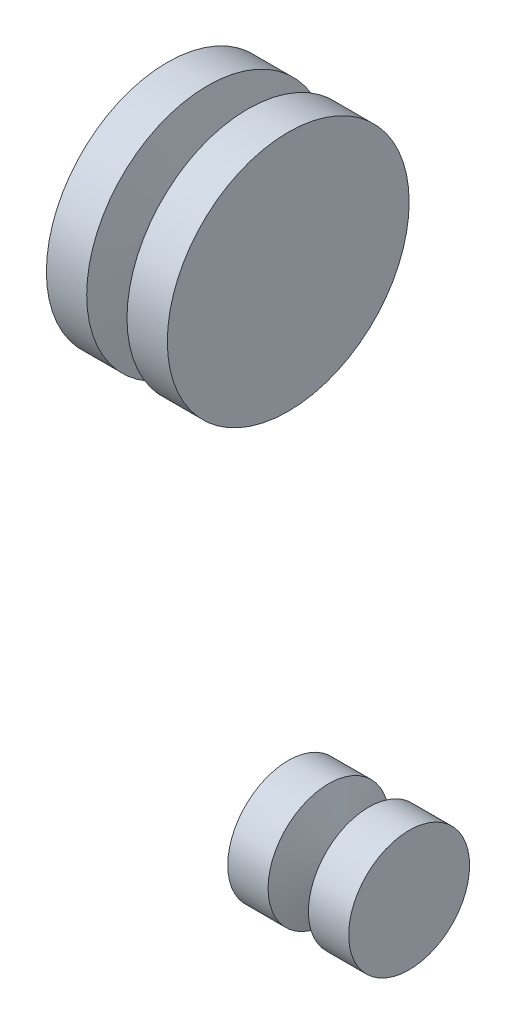
ISO-10303-21;
HEADER;
FILE_DESCRIPTION(('STEP AP214'),'2;1');
FILE_NAME('part.step','',(''),(''),'','','');
FILE_SCHEMA(('AUTOMOTIVE_DESIGN { 1 0 10303 214 1 1 1 1 }'));
ENDSEC;
DATA;
#1=APPLICATION_CONTEXT('core data for automotive mechanical design processes');
#2=APPLICATION_PROTOCOL_DEFINITION('international standard','automotive_design',2000,#1);
#3=PRODUCT_CONTEXT('',#1,'mechanical');
#4=PRODUCT('Part','Part','',(#3));
#5=PRODUCT_RELATED_PRODUCT_CATEGORY('part','',(#4));
#6=PRODUCT_DEFINITION_FORMATION('','',#4);
#7=PRODUCT_DEFINITION_CONTEXT('part definition',#1,'design');
#8=PRODUCT_DEFINITION('design','',#6,#7);
#9=PRODUCT_DEFINITION_SHAPE('','',#8);
#10=(LENGTH_UNIT() NAMED_UNIT(*) SI_UNIT(.MILLI.,.METRE.));
#11=(NAMED_UNIT(*) PLANE_ANGLE_UNIT() SI_UNIT($,.RADIAN.));
#12=(NAMED_UNIT(*) SI_UNIT($,.STERADIAN.) SOLID_ANGLE_UNIT());
#13=UNCERTAINTY_MEASURE_WITH_UNIT(LENGTH_MEASURE(1.E-05),#10,'distance_accuracy_value','');
#14=(GEOMETRIC_REPRESENTATION_CONTEXT(3) GLOBAL_UNCERTAINTY_ASSIGNED_CONTEXT((#13)) GLOBAL_UNIT_ASSIGNED_CONTEXT((#10,
#11,#12)) REPRESENTATION_CONTEXT('',''));
#15=CARTESIAN_POINT('',(0.,0.,0.));
#16=DIRECTION('',(0.,0.,1.));
#17=DIRECTION('',(1.,0.,0.));
#18=AXIS2_PLACEMENT_3D('',#15,#16,#17);
#19=CARTESIAN_POINT('',(5.,100.,20.));
#20=DIRECTION('',(-1.,0.,0.));
#21=DIRECTION('',(0.,0.,1.));
#22=AXIS2_PLACEMENT_3D('',#19,#20,#21);
#23=CYLINDRICAL_SURFACE('',#22,5.);
#24=CARTESIAN_POINT('',(5.,100.,20.));
#25=DIRECTION('',(1.,0.,0.));
#26=DIRECTION('',(0.,0.,-1.));
#27=AXIS2_PLACEMENT_3D('',#24,#25,#26);
#28=CIRCLE('',#27,5.);
#29=CARTESIAN_POINT('',(5.,100.,15.));
#30=VERTEX_POINT('',#29);
#31=EDGE_CURVE('E47',#30,#30,#28,.T.);
#32=ORIENTED_EDGE('',*,*,#31,.F.);
#33=EDGE_LOOP('',(#32));
#34=FACE_BOUND('',#33,.T.);
#35=CARTESIAN_POINT('',(1.66666666666667,100.,20.));
#36=DIRECTION('',(-1.,0.,0.));
#37=DIRECTION('',(0.,0.,1.));
#38=AXIS2_PLACEMENT_3D('',#35,#36,#37);
#39=CIRCLE('',#38,5.00000000000002);
#40=CARTESIAN_POINT('',(1.66666666666667,100.,15.));
#41=VERTEX_POINT('',#40);
#42=EDGE_CURVE('E58',#41,#41,#39,.T.);
#43=ORIENTED_EDGE('',*,*,#42,.F.);
#44=EDGE_LOOP('',(#43));
#45=FACE_BOUND('',#44,.T.);
#46=ADVANCED_FACE('F43',(#34,#45),#23,.T.);
#47=CARTESIAN_POINT('',(5.,100.,20.));
#48=DIRECTION('',(1.,0.,0.));
#49=DIRECTION('',(0.,0.,-1.));
#50=AXIS2_PLACEMENT_3D('',#47,#48,#49);
#51=PLANE('',#50);
#52=ORIENTED_EDGE('',*,*,#31,.T.);
#53=EDGE_LOOP('',(#52));
#54=FACE_BOUND('',#53,.T.);
#55=ADVANCED_FACE('F45',(#54),#51,.T.);
#56=CARTESIAN_POINT('',(-5.,100.,20.));
#57=DIRECTION('',(-1.,0.,0.));
#58=DIRECTION('',(0.,0.,1.));
#59=AXIS2_PLACEMENT_3D('',#56,#57,#58);
#60=CYLINDRICAL_SURFACE('',#59,0.999999999999987);
#61=CARTESIAN_POINT('',(-0.5,100.,20.));
#62=DIRECTION('',(-1.,0.,0.));
#63=DIRECTION('',(0.,0.,1.));
#64=AXIS2_PLACEMENT_3D('',#61,#62,#63);
#65=CIRCLE('',#64,0.999999999999987);
#66=CARTESIAN_POINT('',(-0.5,100.,21.));
#67=VERTEX_POINT('',#66);
#68=EDGE_CURVE('E64',#67,#67,#65,.T.);
#69=ORIENTED_EDGE('',*,*,#68,.F.);
#70=EDGE_LOOP('',(#69));
#71=FACE_BOUND('',#70,.T.);
#72=CARTESIAN_POINT('',(0.5,100.,20.));
#73=DIRECTION('',(-1.,0.,0.));
#74=DIRECTION('',(0.,0.,1.));
#75=AXIS2_PLACEMENT_3D('',#72,#73,#74);
#76=CIRCLE('',#75,0.999999999999987);
#77=CARTESIAN_POINT('',(0.500000000000001,100.,19.));
#78=VERTEX_POINT('',#77);
#79=EDGE_CURVE('E54',#78,#78,#76,.T.);
#80=ORIENTED_EDGE('',*,*,#79,.T.);
#81=EDGE_LOOP('',(#80));
#82=FACE_BOUND('',#81,.T.);
#83=ADVANCED_FACE('F71',(#71,#82),#60,.T.);
#84=CARTESIAN_POINT('',(0.5,100.,20.));
#85=DIRECTION('',(1.,0.,0.));
#86=DIRECTION('',(0.,0.,-1.));
#87=AXIS2_PLACEMENT_3D('',#84,#85,#86);
#88=CONICAL_SURFACE('',#87,0.999999999999987,1.28700221758657);
#89=CARTESIAN_POINT('',(1.66666666666667,100.,15.));
#90=CARTESIAN_POINT('',(1.6545138888889,100.,15.0416666666666));
#91=CARTESIAN_POINT('',(1.64236111111112,100.,15.0833333333333));
#92=CARTESIAN_POINT('',(1.61805555555556,100.,15.1666666666666));
#93=CARTESIAN_POINT('',(1.60590277777778,100.,15.2083333333333));
#94=CARTESIAN_POINT('',(1.58159722222223,100.,15.2916666666666));
#95=CARTESIAN_POINT('',(1.56944444444445,100.,15.3333333333333));
#96=CARTESIAN_POINT('',(1.5451388888889,100.,15.4166666666666));
#97=CARTESIAN_POINT('',(1.53298611111112,100.,15.4583333333333));
#98=CARTESIAN_POINT('',(1.50868055555556,100.,15.5416666666667));
#99=CARTESIAN_POINT('',(1.49652777777778,100.,15.5833333333333));
#100=CARTESIAN_POINT('',(1.47222222222223,100.,15.6666666666666));
#101=CARTESIAN_POINT('',(1.46006944444445,100.,15.7083333333333));
#102=CARTESIAN_POINT('',(1.43576388888889,100.,15.7916666666667));
#103=CARTESIAN_POINT('',(1.42361111111112,100.,15.8333333333333));
#104=CARTESIAN_POINT('',(1.39930555555556,100.,15.9166666666667));
#105=CARTESIAN_POINT('',(1.38715277777778,100.,15.9583333333333));
#106=CARTESIAN_POINT('',(1.36284722222223,100.,16.0416666666667));
#107=CARTESIAN_POINT('',(1.35069444444445,100.,16.0833333333333));
#108=CARTESIAN_POINT('',(1.32638888888889,100.,16.1666666666667));
#109=CARTESIAN_POINT('',(1.31423611111112,100.,16.2083333333333));
#110=CARTESIAN_POINT('',(1.28993055555556,100.,16.2916666666667));
#111=CARTESIAN_POINT('',(1.27777777777778,100.,16.3333333333333));
#112=CARTESIAN_POINT('',(1.25347222222223,100.,16.4166666666667));
#113=CARTESIAN_POINT('',(1.24131944444445,100.,16.4583333333333));
#114=CARTESIAN_POINT('',(1.21701388888889,100.,16.5416666666667));
#115=CARTESIAN_POINT('',(1.20486111111112,100.,16.5833333333333));
#116=CARTESIAN_POINT('',(1.18055555555556,100.,16.6666666666667));
#117=CARTESIAN_POINT('',(1.16840277777778,100.,16.7083333333333));
#118=CARTESIAN_POINT('',(1.14409722222223,100.,16.7916666666667));
#119=CARTESIAN_POINT('',(1.13194444444445,100.,16.8333333333333));
#120=CARTESIAN_POINT('',(1.10763888888889,100.,16.9166666666667));
#121=CARTESIAN_POINT('',(1.09548611111112,100.,16.9583333333333));
#122=CARTESIAN_POINT('',(1.07118055555556,100.,17.0416666666667));
#123=CARTESIAN_POINT('',(1.05902777777778,100.,17.0833333333333));
#124=CARTESIAN_POINT('',(1.03472222222223,100.,17.1666666666667));
#125=CARTESIAN_POINT('',(1.02256944444445,100.,17.2083333333333));
#126=CARTESIAN_POINT('',(0.998263888888892,100.,17.2916666666667));
#127=CARTESIAN_POINT('',(0.986111111111114,100.,17.3333333333333));
#128=CARTESIAN_POINT('',(0.961805555555559,100.,17.4166666666667));
#129=CARTESIAN_POINT('',(0.949652777777781,100.,17.4583333333333));
#130=CARTESIAN_POINT('',(0.925347222222225,100.,17.5416666666667));
#131=CARTESIAN_POINT('',(0.913194444444447,100.,17.5833333333333));
#132=CARTESIAN_POINT('',(0.888888888888892,100.,17.6666666666667));
#133=CARTESIAN_POINT('',(0.876736111111114,100.,17.7083333333333));
#134=CARTESIAN_POINT('',(0.852430555555558,100.,17.7916666666667));
#135=CARTESIAN_POINT('',(0.84027777777778,100.,17.8333333333333));
#136=CARTESIAN_POINT('',(0.815972222222225,100.,17.9166666666667));
#137=CARTESIAN_POINT('',(0.803819444444447,100.,17.9583333333333));
#138=CARTESIAN_POINT('',(0.779513888888891,100.,18.0416666666667));
#139=CARTESIAN_POINT('',(0.767361111111113,100.,18.0833333333333));
#140=CARTESIAN_POINT('',(0.743055555555557,100.,18.1666666666667));
#141=CARTESIAN_POINT('',(0.730902777777779,100.,18.2083333333333));
#142=CARTESIAN_POINT('',(0.706597222222224,100.,18.2916666666667));
#143=CARTESIAN_POINT('',(0.694444444444446,100.,18.3333333333333));
#144=CARTESIAN_POINT('',(0.670138888888891,100.,18.4166666666667));
#145=CARTESIAN_POINT('',(0.657986111111113,100.,18.4583333333333));
#146=CARTESIAN_POINT('',(0.633680555555557,100.,18.5416666666667));
#147=CARTESIAN_POINT('',(0.621527777777779,100.,18.5833333333333));
#148=CARTESIAN_POINT('',(0.597222222222223,100.,18.6666666666667));
#149=CARTESIAN_POINT('',(0.585069444444445,100.,18.7083333333333));
#150=CARTESIAN_POINT('',(0.56076388888889,100.,18.7916666666667));
#151=CARTESIAN_POINT('',(0.548611111111112,100.,18.8333333333333));
#152=CARTESIAN_POINT('',(0.524305555555556,100.,18.9166666666667));
#153=CARTESIAN_POINT('',(0.512152777777778,100.,18.9583333333333));
#154=CARTESIAN_POINT('',(0.5,100.,19.));
#155=B_SPLINE_CURVE_WITH_KNOTS('',3,(#89,#90,#91,#92,#93,#94,#95,#96,#97,#98,#99,#100,#101,#102,
#103,#104,#105,#106,#107,#108,#109,#110,#111,#112,#113,#114,#115,#116,#117,#118,#119,#120,#121,
#122,#123,#124,#125,#126,#127,#128,#129,#130,#131,#132,#133,#134,#135,#136,#137,#138,#139,#140,
#141,#142,#143,#144,#145,#146,#147,#148,#149,#150,#151,#152,#153,#154),.UNSPECIFIED.,.F.,.F.,(4,
2,2,2,2,2,2,2,2,2,2,2,2,2,2,2,2,2,2,2,2,2,2,2,2,2,2,2,2,2,2,2,4),(0.,0.130208333333334,
0.260416666666667,0.390625000000002,0.520833333333337,0.651041666666671,0.781250000000004,
0.911458333333341,1.04166666666667,1.17187500000001,1.30208333333334,1.43229166666668,
1.56250000000001,1.69270833333335,1.82291666666668,1.95312500000002,2.08333333333335,
2.21354166666668,2.34375000000002,2.47395833333335,2.60416666666669,2.73437500000002,
2.86458333333335,2.99479166666669,3.12500000000002,3.25520833333336,3.38541666666669,
3.51562500000003,3.64583333333336,3.77604166666669,3.90625000000003,4.03645833333337,
4.1666666666667),.UNSPECIFIED.);
#156=EDGE_CURVE('BSEAM74',#41,#78,#155,.T.);
#157=ORIENTED_EDGE('',*,*,#42,.T.);
#158=ORIENTED_EDGE('',*,*,#79,.F.);
#159=ORIENTED_EDGE('',*,*,#156,.T.);
#160=ORIENTED_EDGE('',*,*,#156,.F.);
#161=EDGE_LOOP('',(#157,#159,#158,#160));
#162=FACE_BOUND('',#161,.T.);
#163=ADVANCED_FACE('F74',(#162),#88,.T.);
#164=CARTESIAN_POINT('',(-1.66666666666667,100.,20.));
#165=DIRECTION('',(-1.,0.,0.));
#166=DIRECTION('',(0.,0.,1.));
#167=AXIS2_PLACEMENT_3D('',#164,#165,#166);
#168=CONICAL_SURFACE('',#167,5.,1.28700221758657);
#169=CARTESIAN_POINT('',(-1.66666666666667,100.,20.));
#170=DIRECTION('',(-1.,0.,0.));
#171=DIRECTION('',(0.,0.,1.));
#172=AXIS2_PLACEMENT_3D('',#169,#170,#171);
#173=CIRCLE('',#172,5.);
#174=CARTESIAN_POINT('',(-1.66666666666667,100.,25.));
#175=VERTEX_POINT('',#174);
#176=EDGE_CURVE('E61',#175,#175,#173,.T.);
#177=CARTESIAN_POINT('',(-0.5,100.,21.));
#178=CARTESIAN_POINT('',(-0.512152777777778,100.,21.0416666666667));
#179=CARTESIAN_POINT('',(-0.524305555555556,100.,21.0833333333333));
#180=CARTESIAN_POINT('',(-0.548611111111111,100.,21.1666666666667));
#181=CARTESIAN_POINT('',(-0.560763888888889,100.,21.2083333333333));
#182=CARTESIAN_POINT('',(-0.585069444444445,100.,21.2916666666667));
#183=CARTESIAN_POINT('',(-0.597222222222223,100.,21.3333333333333));
#184=CARTESIAN_POINT('',(-0.621527777777778,100.,21.4166666666667));
#185=CARTESIAN_POINT('',(-0.633680555555556,100.,21.4583333333333));
#186=CARTESIAN_POINT('',(-0.657986111111112,100.,21.5416666666667));
#187=CARTESIAN_POINT('',(-0.670138888888889,100.,21.5833333333333));
#188=CARTESIAN_POINT('',(-0.694444444444445,100.,21.6666666666667));
#189=CARTESIAN_POINT('',(-0.706597222222222,100.,21.7083333333333));
#190=CARTESIAN_POINT('',(-0.730902777777778,100.,21.7916666666667));
#191=CARTESIAN_POINT('',(-0.743055555555556,100.,21.8333333333333));
#192=CARTESIAN_POINT('',(-0.767361111111111,100.,21.9166666666667));
#193=CARTESIAN_POINT('',(-0.779513888888889,100.,21.9583333333333));
#194=CARTESIAN_POINT('',(-0.803819444444445,100.,22.0416666666667));
#195=CARTESIAN_POINT('',(-0.815972222222223,100.,22.0833333333333));
#196=CARTESIAN_POINT('',(-0.840277777777778,100.,22.1666666666667));
#197=CARTESIAN_POINT('',(-0.852430555555556,100.,22.2083333333333));
#198=CARTESIAN_POINT('',(-0.876736111111111,100.,22.2916666666667));
#199=CARTESIAN_POINT('',(-0.888888888888889,100.,22.3333333333333));
#200=CARTESIAN_POINT('',(-0.913194444444445,100.,22.4166666666667));
#201=CARTESIAN_POINT('',(-0.925347222222223,100.,22.4583333333333));
#202=CARTESIAN_POINT('',(-0.949652777777778,100.,22.5416666666667));
#203=CARTESIAN_POINT('',(-0.961805555555555,100.,22.5833333333333));
#204=CARTESIAN_POINT('',(-0.986111111111111,100.,22.6666666666667));
#205=CARTESIAN_POINT('',(-0.998263888888889,100.,22.7083333333333));
#206=CARTESIAN_POINT('',(-1.02256944444444,100.,22.7916666666667));
#207=CARTESIAN_POINT('',(-1.03472222222222,100.,22.8333333333333));
#208=CARTESIAN_POINT('',(-1.05902777777778,100.,22.9166666666667));
#209=CARTESIAN_POINT('',(-1.07118055555556,100.,22.9583333333333));
#210=CARTESIAN_POINT('',(-1.09548611111111,100.,23.0416666666667));
#211=CARTESIAN_POINT('',(-1.10763888888889,100.,23.0833333333333));
#212=CARTESIAN_POINT('',(-1.13194444444444,100.,23.1666666666667));
#213=CARTESIAN_POINT('',(-1.14409722222222,100.,23.2083333333333));
#214=CARTESIAN_POINT('',(-1.16840277777778,100.,23.2916666666667));
#215=CARTESIAN_POINT('',(-1.18055555555556,100.,23.3333333333333));
#216=CARTESIAN_POINT('',(-1.20486111111111,100.,23.4166666666667));
#217=CARTESIAN_POINT('',(-1.21701388888889,100.,23.4583333333333));
#218=CARTESIAN_POINT('',(-1.24131944444444,100.,23.5416666666667));
#219=CARTESIAN_POINT('',(-1.25347222222222,100.,23.5833333333333));
#220=CARTESIAN_POINT('',(-1.27777777777778,100.,23.6666666666667));
#221=CARTESIAN_POINT('',(-1.28993055555556,100.,23.7083333333333));
#222=CARTESIAN_POINT('',(-1.31423611111111,100.,23.7916666666667));
#223=CARTESIAN_POINT('',(-1.32638888888889,100.,23.8333333333333));
#224=CARTESIAN_POINT('',(-1.35069444444444,100.,23.9166666666667));
#225=CARTESIAN_POINT('',(-1.36284722222222,100.,23.9583333333333));
#226=CARTESIAN_POINT('',(-1.38715277777778,100.,24.0416666666667));
#227=CARTESIAN_POINT('',(-1.39930555555556,100.,24.0833333333333));
#228=CARTESIAN_POINT('',(-1.42361111111111,100.,24.1666666666667));
#229=CARTESIAN_POINT('',(-1.43576388888889,100.,24.2083333333333));
#230=CARTESIAN_POINT('',(-1.46006944444444,100.,24.2916666666667));
#231=CARTESIAN_POINT('',(-1.47222222222222,100.,24.3333333333333));
#232=CARTESIAN_POINT('',(-1.49652777777778,100.,24.4166666666667));
#233=CARTESIAN_POINT('',(-1.50868055555556,100.,24.4583333333333));
#234=CARTESIAN_POINT('',(-1.53298611111111,100.,24.5416666666667));
#235=CARTESIAN_POINT('',(-1.54513888888889,100.,24.5833333333333));
#236=CARTESIAN_POINT('',(-1.56944444444444,100.,24.6666666666667));
#237=CARTESIAN_POINT('',(-1.58159722222222,100.,24.7083333333333));
#238=CARTESIAN_POINT('',(-1.60590277777778,100.,24.7916666666667));
#239=CARTESIAN_POINT('',(-1.61805555555556,100.,24.8333333333333));
#240=CARTESIAN_POINT('',(-1.64236111111111,100.,24.9166666666667));
#241=CARTESIAN_POINT('',(-1.65451388888889,100.,24.9583333333333));
#242=CARTESIAN_POINT('',(-1.66666666666667,100.,25.));
#243=B_SPLINE_CURVE_WITH_KNOTS('',3,(#177,#178,#179,#180,#181,#182,#183,#184,#185,#186,#187,
#188,#189,#190,#191,#192,#193,#194,#195,#196,#197,#198,#199,#200,#201,#202,#203,#204,#205,#206,
#207,#208,#209,#210,#211,#212,#213,#214,#215,#216,#217,#218,#219,#220,#221,#222,#223,#224,#225,
#226,#227,#228,#229,#230,#231,#232,#233,#234,#235,#236,#237,#238,#239,#240,#241,#242),
.UNSPECIFIED.,.F.,.F.,(4,2,2,2,2,2,2,2,2,2,2,2,2,2,2,2,2,2,2,2,2,2,2,2,2,2,2,2,2,2,2,2,4),(0.,
0.130208333333333,0.260416666666667,0.390625,0.520833333333334,0.651041666666667,
0.781250000000004,0.911458333333337,1.04166666666667,1.171875,1.30208333333334,1.43229166666667,
1.5625,1.69270833333334,1.82291666666668,1.95312500000001,2.08333333333334,2.21354166666668,
2.34375000000001,2.47395833333334,2.60416666666668,2.73437500000001,2.86458333333335,
2.99479166666668,3.12500000000001,3.25520833333335,3.38541666666668,3.51562500000001,
3.64583333333335,3.77604166666668,3.90625000000002,4.03645833333335,4.16666666666668),.UNSPECIFIED.);
#244=EDGE_CURVE('BSEAM68',#67,#175,#243,.T.);
#245=ORIENTED_EDGE('',*,*,#68,.T.);
#246=ORIENTED_EDGE('',*,*,#176,.F.);
#247=ORIENTED_EDGE('',*,*,#244,.T.);
#248=ORIENTED_EDGE('',*,*,#244,.F.);
#249=EDGE_LOOP('',(#245,#247,#246,#248));
#250=FACE_BOUND('',#249,.T.);
#251=ADVANCED_FACE('F68',(#250),#168,.T.);
#252=CARTESIAN_POINT('',(-5.,100.,20.));
#253=DIRECTION('',(1.,0.,0.));
#254=DIRECTION('',(0.,0.,-1.));
#255=AXIS2_PLACEMENT_3D('',#252,#253,#254);
#256=PLANE('',#255);
#257=CARTESIAN_POINT('',(-5.,100.,20.));
#258=DIRECTION('',(1.,0.,0.));
#259=DIRECTION('',(0.,0.,-1.));
#260=AXIS2_PLACEMENT_3D('',#257,#258,#259);
#261=CIRCLE('',#260,5.);
#262=CARTESIAN_POINT('',(-5.,100.,15.));
#263=VERTEX_POINT('',#262);
#264=EDGE_CURVE('E11',#263,#263,#261,.T.);
#265=ORIENTED_EDGE('',*,*,#264,.F.);
#266=EDGE_LOOP('',(#265));
#267=FACE_BOUND('',#266,.T.);
#268=ADVANCED_FACE('F84',(#267),#256,.F.);
#269=ORIENTED_EDGE('',*,*,#264,.T.);
#270=EDGE_LOOP('',(#269));
#271=FACE_BOUND('',#270,.T.);
#272=ORIENTED_EDGE('',*,*,#176,.T.);
#273=EDGE_LOOP('',(#272));
#274=FACE_BOUND('',#273,.T.);
#275=ADVANCED_FACE('F89',(#271,#274),#23,.T.);
#276=CLOSED_SHELL('',(#46,#55,#83,#163,#251,#268,#275));
#277=MANIFOLD_SOLID_BREP('B2',#276);
#278=CARTESIAN_POINT('',(5.,150.,30.));
#279=DIRECTION('',(-1.,0.,0.));
#280=DIRECTION('',(0.,0.,1.));
#281=AXIS2_PLACEMENT_3D('',#278,#279,#280);
#282=CYLINDRICAL_SURFACE('',#281,10.);
#283=CARTESIAN_POINT('',(5.,150.,30.));
#284=DIRECTION('',(1.,0.,0.));
#285=DIRECTION('',(0.,0.,-1.));
#286=AXIS2_PLACEMENT_3D('',#283,#284,#285);
#287=CIRCLE('',#286,10.);
#288=CARTESIAN_POINT('',(5.,150.,20.));
#289=VERTEX_POINT('',#288);
#290=EDGE_CURVE('E42',#289,#289,#287,.T.);
#291=ORIENTED_EDGE('',*,*,#290,.F.);
#292=EDGE_LOOP('',(#291));
#293=FACE_BOUND('',#292,.T.);
#294=CARTESIAN_POINT('',(1.66666666666667,150.,30.));
#295=DIRECTION('',(-1.,0.,0.));
#296=DIRECTION('',(0.,0.,1.));
#297=AXIS2_PLACEMENT_3D('',#294,#295,#296);
#298=CIRCLE('',#297,10.);
#299=CARTESIAN_POINT('',(1.66666666666667,150.,20.));
#300=VERTEX_POINT('',#299);
#301=EDGE_CURVE('E167',#300,#300,#298,.T.);
#302=ORIENTED_EDGE('',*,*,#301,.F.);
#303=EDGE_LOOP('',(#302));
#304=FACE_BOUND('',#303,.T.);
#305=ADVANCED_FACE('F157',(#293,#304),#282,.T.);
#306=CARTESIAN_POINT('',(5.,150.,30.));
#307=DIRECTION('',(1.,0.,0.));
#308=DIRECTION('',(0.,0.,-1.));
#309=AXIS2_PLACEMENT_3D('',#306,#307,#308);
#310=PLANE('',#309);
#311=ORIENTED_EDGE('',*,*,#290,.T.);
#312=EDGE_LOOP('',(#311));
#313=FACE_BOUND('',#312,.T.);
#314=ADVANCED_FACE('F187',(#313),#310,.T.);
#315=CARTESIAN_POINT('',(0.500000000000001,150.,30.));
#316=DIRECTION('',(1.,0.,0.));
#317=DIRECTION('',(0.,0.,-1.));
#318=AXIS2_PLACEMENT_3D('',#315,#316,#317);
#319=CONICAL_SURFACE('',#318,1.,1.44188555511091);
#320=CARTESIAN_POINT('',(0.500000000000001,150.,30.));
#321=DIRECTION('',(-1.,0.,0.));
#322=DIRECTION('',(0.,0.,1.));
#323=AXIS2_PLACEMENT_3D('',#320,#321,#322);
#324=CIRCLE('',#323,1.);
#325=CARTESIAN_POINT('',(0.500000000000001,150.,29.));
#326=VERTEX_POINT('',#325);
#327=EDGE_CURVE('E177',#326,#326,#324,.T.);
#328=CARTESIAN_POINT('',(1.66666666666667,150.,20.));
#329=CARTESIAN_POINT('',(1.65451388888889,150.,20.09375));
#330=CARTESIAN_POINT('',(1.64236111111111,150.,20.1875));
#331=CARTESIAN_POINT('',(1.61805555555556,150.,20.375));
#332=CARTESIAN_POINT('',(1.60590277777778,150.,20.46875));
#333=CARTESIAN_POINT('',(1.58159722222222,150.,20.65625));
#334=CARTESIAN_POINT('',(1.56944444444444,150.,20.75));
#335=CARTESIAN_POINT('',(1.54513888888889,150.,20.9375));
#336=CARTESIAN_POINT('',(1.53298611111111,150.,21.03125));
#337=CARTESIAN_POINT('',(1.50868055555556,150.,21.21875));
#338=CARTESIAN_POINT('',(1.49652777777778,150.,21.3125));
#339=CARTESIAN_POINT('',(1.47222222222222,150.,21.5));
#340=CARTESIAN_POINT('',(1.46006944444444,150.,21.59375));
#341=CARTESIAN_POINT('',(1.43576388888889,150.,21.78125));
#342=CARTESIAN_POINT('',(1.42361111111111,150.,21.875));
#343=CARTESIAN_POINT('',(1.39930555555556,150.,22.0625));
#344=CARTESIAN_POINT('',(1.38715277777778,150.,22.15625));
#345=CARTESIAN_POINT('',(1.36284722222222,150.,22.34375));
#346=CARTESIAN_POINT('',(1.35069444444444,150.,22.4375));
#347=CARTESIAN_POINT('',(1.32638888888889,150.,22.625));
#348=CARTESIAN_POINT('',(1.31423611111111,150.,22.71875));
#349=CARTESIAN_POINT('',(1.28993055555556,150.,22.90625));
#350=CARTESIAN_POINT('',(1.27777777777778,150.,23.));
#351=CARTESIAN_POINT('',(1.25347222222222,150.,23.1875));
#352=CARTESIAN_POINT('',(1.24131944444444,150.,23.28125));
#353=CARTESIAN_POINT('',(1.21701388888889,150.,23.46875));
#354=CARTESIAN_POINT('',(1.20486111111111,150.,23.5625));
#355=CARTESIAN_POINT('',(1.18055555555556,150.,23.75));
#356=CARTESIAN_POINT('',(1.16840277777778,150.,23.84375));
#357=CARTESIAN_POINT('',(1.14409722222222,150.,24.03125));
#358=CARTESIAN_POINT('',(1.13194444444444,150.,24.125));
#359=CARTESIAN_POINT('',(1.10763888888889,150.,24.3125));
#360=CARTESIAN_POINT('',(1.09548611111111,150.,24.40625));
#361=CARTESIAN_POINT('',(1.07118055555556,150.,24.59375));
#362=CARTESIAN_POINT('',(1.05902777777778,150.,24.6875));
#363=CARTESIAN_POINT('',(1.03472222222222,150.,24.875));
#364=CARTESIAN_POINT('',(1.02256944444445,150.,24.96875));
#365=CARTESIAN_POINT('',(0.99826388888889,150.,25.15625));
#366=CARTESIAN_POINT('',(0.986111111111111,150.,25.25));
#367=CARTESIAN_POINT('',(0.961805555555556,150.,25.4375));
#368=CARTESIAN_POINT('',(0.949652777777778,150.,25.53125));
#369=CARTESIAN_POINT('',(0.925347222222223,150.,25.71875));
#370=CARTESIAN_POINT('',(0.913194444444445,150.,25.8125));
#371=CARTESIAN_POINT('',(0.88888888888889,150.,26.));
#372=CARTESIAN_POINT('',(0.876736111111112,150.,26.09375));
#373=CARTESIAN_POINT('',(0.852430555555556,150.,26.28125));
#374=CARTESIAN_POINT('',(0.840277777777779,150.,26.375));
#375=CARTESIAN_POINT('',(0.815972222222223,150.,26.5625));
#376=CARTESIAN_POINT('',(0.803819444444445,150.,26.65625));
#377=CARTESIAN_POINT('',(0.77951388888889,150.,26.84375));
#378=CARTESIAN_POINT('',(0.767361111111112,150.,26.9375));
#379=CARTESIAN_POINT('',(0.743055555555556,150.,27.125));
#380=CARTESIAN_POINT('',(0.730902777777779,150.,27.21875));
#381=CARTESIAN_POINT('',(0.706597222222223,150.,27.40625));
#382=CARTESIAN_POINT('',(0.694444444444445,150.,27.5));
#383=CARTESIAN_POINT('',(0.67013888888889,150.,27.6875));
#384=CARTESIAN_POINT('',(0.657986111111112,150.,27.78125));
#385=CARTESIAN_POINT('',(0.633680555555557,150.,27.96875));
#386=CARTESIAN_POINT('',(0.621527777777779,150.,28.0625));
#387=CARTESIAN_POINT('',(0.597222222222223,150.,28.25));
#388=CARTESIAN_POINT('',(0.585069444444446,150.,28.34375));
#389=CARTESIAN_POINT('',(0.56076388888889,150.,28.53125));
#390=CARTESIAN_POINT('',(0.548611111111112,150.,28.625));
#391=CARTESIAN_POINT('',(0.524305555555557,150.,28.8125));
#392=CARTESIAN_POINT('',(0.512152777777779,150.,28.90625));
#393=CARTESIAN_POINT('',(0.500000000000001,150.,29.));
#394=B_SPLINE_CURVE_WITH_KNOTS('',3,(#328,#329,#330,#331,#332,#333,#334,#335,#336,#337,#338,
#339,#340,#341,#342,#343,#344,#345,#346,#347,#348,#349,#350,#351,#352,#353,#354,#355,#356,#357,
#358,#359,#360,#361,#362,#363,#364,#365,#366,#367,#368,#369,#370,#371,#372,#373,#374,#375,#376,
#377,#378,#379,#380,#381,#382,#383,#384,#385,#386,#387,#388,#389,#390,#391,#392,#393),
.UNSPECIFIED.,.F.,.F.,(4,2,2,2,2,2,2,2,2,2,2,2,2,2,2,2,2,2,2,2,2,2,2,2,2,2,2,2,2,2,2,2,4),(0.,
0.283603195626295,0.567206391252583,0.850809586878878,1.13441278250517,1.41801597813146,
1.70161917375775,1.98522236938404,2.26882556501034,2.55242876063663,2.83603195626292,
3.11963515188921,3.4032383475155,3.68684154314179,3.97044473876809,4.25404793439438,
4.53765113002067,4.82125432564696,5.10485752127325,5.38846071689954,5.67206391252584,
5.95566710815213,6.23927030377842,6.52287349940471,6.806476695031,7.0900798906573,
7.37368308628359,7.65728628190988,7.94088947753617,8.22449267316246,8.50809586878875,
8.79169906441505,9.07530226004134),.UNSPECIFIED.);
#395=EDGE_CURVE('BSEAM184',#300,#326,#394,.T.);
#396=ORIENTED_EDGE('',*,*,#301,.T.);
#397=ORIENTED_EDGE('',*,*,#327,.F.);
#398=ORIENTED_EDGE('',*,*,#395,.T.);
#399=ORIENTED_EDGE('',*,*,#395,.F.);
#400=EDGE_LOOP('',(#396,#398,#397,#399));
#401=FACE_BOUND('',#400,.T.);
#402=ADVANCED_FACE('F184',(#401),#319,.T.);
#403=CARTESIAN_POINT('',(-1.66666666666667,150.,30.));
#404=DIRECTION('',(-1.,0.,0.));
#405=DIRECTION('',(0.,0.,1.));
#406=AXIS2_PLACEMENT_3D('',#403,#404,#405);
#407=CONICAL_SURFACE('',#406,10.,1.44188555511091);
#408=CARTESIAN_POINT('',(-0.499999999999999,150.,30.));
#409=DIRECTION('',(-1.,0.,0.));
#410=DIRECTION('',(0.,0.,1.));
#411=AXIS2_PLACEMENT_3D('',#408,#409,#410);
#412=CIRCLE('',#411,1.);
#413=CARTESIAN_POINT('',(-0.499999999999999,150.,31.));
#414=VERTEX_POINT('',#413);
#415=EDGE_CURVE('E174',#414,#414,#412,.T.);
#416=CARTESIAN_POINT('',(-1.66666666666667,150.,30.));
#417=DIRECTION('',(-1.,0.,0.));
#418=DIRECTION('',(0.,0.,1.));
#419=AXIS2_PLACEMENT_3D('',#416,#417,#418);
#420=CIRCLE('',#419,10.);
#421=CARTESIAN_POINT('',(-1.66666666666667,150.,40.));
#422=VERTEX_POINT('',#421);
#423=EDGE_CURVE('E171',#422,#422,#420,.T.);
#424=CARTESIAN_POINT('',(-0.499999999999999,150.,31.));
#425=CARTESIAN_POINT('',(-0.512152777777777,150.,31.09375));
#426=CARTESIAN_POINT('',(-0.524305555555555,150.,31.1875));
#427=CARTESIAN_POINT('',(-0.54861111111111,150.,31.375));
#428=CARTESIAN_POINT('',(-0.560763888888887,150.,31.46875));
#429=CARTESIAN_POINT('',(-0.585069444444443,150.,31.65625));
#430=CARTESIAN_POINT('',(-0.597222222222221,150.,31.75));
#431=CARTESIAN_POINT('',(-0.621527777777777,150.,31.9375));
#432=CARTESIAN_POINT('',(-0.633680555555555,150.,32.03125));
#433=CARTESIAN_POINT('',(-0.65798611111111,150.,32.21875));
#434=CARTESIAN_POINT('',(-0.670138888888888,150.,32.3125));
#435=CARTESIAN_POINT('',(-0.694444444444443,150.,32.5));
#436=CARTESIAN_POINT('',(-0.706597222222221,150.,32.59375));
#437=CARTESIAN_POINT('',(-0.730902777777777,150.,32.78125));
#438=CARTESIAN_POINT('',(-0.743055555555554,150.,32.875));
#439=CARTESIAN_POINT('',(-0.76736111111111,150.,33.0625));
#440=CARTESIAN_POINT('',(-0.779513888888888,150.,33.15625));
#441=CARTESIAN_POINT('',(-0.803819444444444,150.,33.34375));
#442=CARTESIAN_POINT('',(-0.815972222222221,150.,33.4375));
#443=CARTESIAN_POINT('',(-0.840277777777777,150.,33.625));
#444=CARTESIAN_POINT('',(-0.852430555555555,150.,33.71875));
#445=CARTESIAN_POINT('',(-0.87673611111111,150.,33.90625));
#446=CARTESIAN_POINT('',(-0.888888888888888,150.,34.));
#447=CARTESIAN_POINT('',(-0.913194444444443,150.,34.1875));
#448=CARTESIAN_POINT('',(-0.925347222222222,150.,34.28125));
#449=CARTESIAN_POINT('',(-0.949652777777777,150.,34.46875));
#450=CARTESIAN_POINT('',(-0.961805555555554,150.,34.5625));
#451=CARTESIAN_POINT('',(-0.98611111111111,150.,34.75));
#452=CARTESIAN_POINT('',(-0.998263888888888,150.,34.84375));
#453=CARTESIAN_POINT('',(-1.02256944444444,150.,35.03125));
#454=CARTESIAN_POINT('',(-1.03472222222222,150.,35.125));
#455=CARTESIAN_POINT('',(-1.05902777777778,150.,35.3125));
#456=CARTESIAN_POINT('',(-1.07118055555556,150.,35.40625));
#457=CARTESIAN_POINT('',(-1.09548611111111,150.,35.59375));
#458=CARTESIAN_POINT('',(-1.10763888888889,150.,35.6875));
#459=CARTESIAN_POINT('',(-1.13194444444444,150.,35.875));
#460=CARTESIAN_POINT('',(-1.14409722222222,150.,35.96875));
#461=CARTESIAN_POINT('',(-1.16840277777778,150.,36.15625));
#462=CARTESIAN_POINT('',(-1.18055555555555,150.,36.25));
#463=CARTESIAN_POINT('',(-1.20486111111111,150.,36.4375));
#464=CARTESIAN_POINT('',(-1.21701388888889,150.,36.53125));
#465=CARTESIAN_POINT('',(-1.24131944444444,150.,36.71875));
#466=CARTESIAN_POINT('',(-1.25347222222222,150.,36.8125));
#467=CARTESIAN_POINT('',(-1.27777777777778,150.,37.));
#468=CARTESIAN_POINT('',(-1.28993055555555,150.,37.09375));
#469=CARTESIAN_POINT('',(-1.31423611111111,150.,37.28125));
#470=CARTESIAN_POINT('',(-1.32638888888889,150.,37.375));
#471=CARTESIAN_POINT('',(-1.35069444444444,150.,37.5625));
#472=CARTESIAN_POINT('',(-1.36284722222222,150.,37.65625));
#473=CARTESIAN_POINT('',(-1.38715277777778,150.,37.84375));
#474=CARTESIAN_POINT('',(-1.39930555555556,150.,37.9375));
#475=CARTESIAN_POINT('',(-1.42361111111111,150.,38.125));
#476=CARTESIAN_POINT('',(-1.43576388888889,150.,38.21875));
#477=CARTESIAN_POINT('',(-1.46006944444444,150.,38.40625));
#478=CARTESIAN_POINT('',(-1.47222222222222,150.,38.5));
#479=CARTESIAN_POINT('',(-1.49652777777778,150.,38.6875));
#480=CARTESIAN_POINT('',(-1.50868055555556,150.,38.78125));
#481=CARTESIAN_POINT('',(-1.53298611111111,150.,38.96875));
#482=CARTESIAN_POINT('',(-1.54513888888889,150.,39.0625));
#483=CARTESIAN_POINT('',(-1.56944444444444,150.,39.25));
#484=CARTESIAN_POINT('',(-1.58159722222222,150.,39.34375));
#485=CARTESIAN_POINT('',(-1.60590277777778,150.,39.53125));
#486=CARTESIAN_POINT('',(-1.61805555555556,150.,39.625));
#487=CARTESIAN_POINT('',(-1.64236111111111,150.,39.8125));
#488=CARTESIAN_POINT('',(-1.65451388888889,150.,39.90625));
#489=CARTESIAN_POINT('',(-1.66666666666667,150.,40.));
#490=B_SPLINE_CURVE_WITH_KNOTS('',3,(#424,#425,#426,#427,#428,#429,#430,#431,#432,#433,#434,
#435,#436,#437,#438,#439,#440,#441,#442,#443,#444,#445,#446,#447,#448,#449,#450,#451,#452,#453,
#454,#455,#456,#457,#458,#459,#460,#461,#462,#463,#464,#465,#466,#467,#468,#469,#470,#471,#472,
#473,#474,#475,#476,#477,#478,#479,#480,#481,#482,#483,#484,#485,#486,#487,#488,#489),
.UNSPECIFIED.,.F.,.F.,(4,2,2,2,2,2,2,2,2,2,2,2,2,2,2,2,2,2,2,2,2,2,2,2,2,2,2,2,2,2,2,2,4),(0.,
0.283603195626292,0.567206391252587,0.850809586878875,1.13441278250516,1.41801597813146,
1.70161917375775,1.98522236938404,2.26882556501033,2.55242876063662,2.83603195626291,
3.11963515188921,3.4032383475155,3.68684154314179,3.97044473876808,4.25404793439437,
4.53765113002066,4.82125432564696,5.10485752127324,5.38846071689954,5.67206391252583,
5.95566710815212,6.23927030377841,6.52287349940471,6.80647669503099,7.09007989065728,
7.37368308628358,7.65728628190987,7.94088947753616,8.22449267316245,8.50809586878874,
8.79169906441504,9.07530226004133),.UNSPECIFIED.);
#491=EDGE_CURVE('BSEAM186',#414,#422,#490,.T.);
#492=ORIENTED_EDGE('',*,*,#415,.T.);
#493=ORIENTED_EDGE('',*,*,#423,.F.);
#494=ORIENTED_EDGE('',*,*,#491,.T.);
#495=ORIENTED_EDGE('',*,*,#491,.F.);
#496=EDGE_LOOP('',(#492,#494,#493,#495));
#497=FACE_BOUND('',#496,.T.);
#498=ADVANCED_FACE('F186',(#497),#407,.T.);
#499=CARTESIAN_POINT('',(-5.,150.,30.));
#500=DIRECTION('',(-1.,0.,0.));
#501=DIRECTION('',(0.,0.,1.));
#502=AXIS2_PLACEMENT_3D('',#499,#500,#501);
#503=CYLINDRICAL_SURFACE('',#502,1.);
#504=ORIENTED_EDGE('',*,*,#327,.T.);
#505=EDGE_LOOP('',(#504));
#506=FACE_BOUND('',#505,.T.);
#507=ORIENTED_EDGE('',*,*,#415,.F.);
#508=EDGE_LOOP('',(#507));
#509=FACE_BOUND('',#508,.T.);
#510=ADVANCED_FACE('F181',(#506,#509),#503,.T.);
#511=CARTESIAN_POINT('',(-5.,150.,30.));
#512=DIRECTION('',(1.,0.,0.));
#513=DIRECTION('',(0.,0.,-1.));
#514=AXIS2_PLACEMENT_3D('',#511,#512,#513);
#515=PLANE('',#514);
#516=CARTESIAN_POINT('',(-5.,150.,30.));
#517=DIRECTION('',(1.,0.,0.));
#518=DIRECTION('',(0.,0.,-1.));
#519=AXIS2_PLACEMENT_3D('',#516,#517,#518);
#520=CIRCLE('',#519,10.);
#521=CARTESIAN_POINT('',(-5.,150.,20.));
#522=VERTEX_POINT('',#521);
#523=EDGE_CURVE('E160',#522,#522,#520,.T.);
#524=ORIENTED_EDGE('',*,*,#523,.F.);
#525=EDGE_LOOP('',(#524));
#526=FACE_BOUND('',#525,.T.);
#527=ADVANCED_FACE('F204',(#526),#515,.F.);
#528=ORIENTED_EDGE('',*,*,#523,.T.);
#529=EDGE_LOOP('',(#528));
#530=FACE_BOUND('',#529,.T.);
#531=ORIENTED_EDGE('',*,*,#423,.T.);
#532=EDGE_LOOP('',(#531));
#533=FACE_BOUND('',#532,.T.);
#534=ADVANCED_FACE('F199',(#530,#533),#282,.T.);
#535=CLOSED_SHELL('',(#305,#314,#402,#498,#510,#527,#534));
#536=MANIFOLD_SOLID_BREP('B6',#535);
#537=ADVANCED_BREP_SHAPE_REPRESENTATION('',(#18,#277,#536),#14);
#538=SHAPE_DEFINITION_REPRESENTATION(#9,#537);
ENDSEC;
END-ISO-10303-21;
